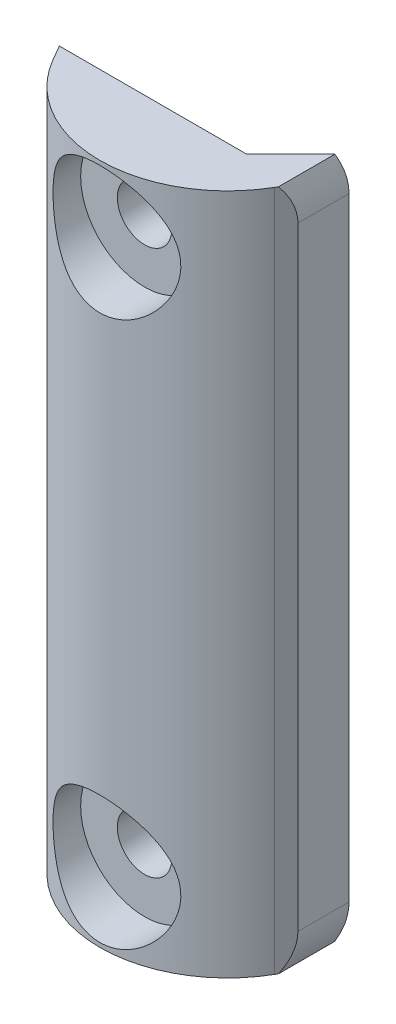
ISO-10303-21;
HEADER;
FILE_DESCRIPTION(('STEP AP214'),'2;1');
FILE_NAME('part.step','',(''),(''),'','','');
FILE_SCHEMA(('AUTOMOTIVE_DESIGN { 1 0 10303 214 1 1 1 1 }'));
ENDSEC;
DATA;
#1=APPLICATION_CONTEXT('core data for automotive mechanical design processes');
#2=APPLICATION_PROTOCOL_DEFINITION('international standard','automotive_design',2000,#1);
#3=PRODUCT_CONTEXT('',#1,'mechanical');
#4=PRODUCT('Part','Part','',(#3));
#5=PRODUCT_RELATED_PRODUCT_CATEGORY('part','',(#4));
#6=PRODUCT_DEFINITION_FORMATION('','',#4);
#7=PRODUCT_DEFINITION_CONTEXT('part definition',#1,'design');
#8=PRODUCT_DEFINITION('design','',#6,#7);
#9=PRODUCT_DEFINITION_SHAPE('','',#8);
#10=(LENGTH_UNIT() NAMED_UNIT(*) SI_UNIT(.MILLI.,.METRE.));
#11=(NAMED_UNIT(*) PLANE_ANGLE_UNIT() SI_UNIT($,.RADIAN.));
#12=(NAMED_UNIT(*) SI_UNIT($,.STERADIAN.) SOLID_ANGLE_UNIT());
#13=UNCERTAINTY_MEASURE_WITH_UNIT(LENGTH_MEASURE(1.E-05),#10,'distance_accuracy_value','');
#14=(GEOMETRIC_REPRESENTATION_CONTEXT(3) GLOBAL_UNCERTAINTY_ASSIGNED_CONTEXT((#13)) GLOBAL_UNIT_ASSIGNED_CONTEXT((#10,
#11,#12)) REPRESENTATION_CONTEXT('',''));
#15=CARTESIAN_POINT('',(0.,0.,0.));
#16=DIRECTION('',(0.,0.,1.));
#17=DIRECTION('',(1.,0.,0.));
#18=AXIS2_PLACEMENT_3D('',#15,#16,#17);
#19=CARTESIAN_POINT('',(7.00000000000001,44.2426406871193,2.87564434701783));
#20=DIRECTION('',(-1.,0.,0.));
#21=DIRECTION('',(0.,0.,1.));
#22=AXIS2_PLACEMENT_3D('',#19,#20,#21);
#23=PLANE('',#22);
#24=DIRECTION('',(0.,0.,1.));
#25=VECTOR('',#24,1.);
#26=CARTESIAN_POINT('',(7.00000000000001,38.,-0.125355652982167));
#27=LINE('',#26,#25);
#28=CARTESIAN_POINT('',(7.00000000000001,38.,-0.124355652982167));
#29=VERTEX_POINT('',#28);
#30=CARTESIAN_POINT('',(7.00000000000001,38.,2.87564434701784));
#31=VERTEX_POINT('',#30);
#32=EDGE_CURVE('E62',#29,#31,#27,.T.);
#33=ORIENTED_EDGE('',*,*,#32,.T.);
#34=DIRECTION('',(0.,-1.,0.));
#35=VECTOR('',#34,1.);
#36=CARTESIAN_POINT('',(7.,40.,2.87564434701783));
#37=LINE('',#36,#35);
#38=CARTESIAN_POINT('',(7.00000000000001,2.,2.87564434701784));
#39=VERTEX_POINT('',#38);
#40=EDGE_CURVE('E47',#31,#39,#37,.T.);
#41=ORIENTED_EDGE('',*,*,#40,.T.);
#42=DIRECTION('',(0.,0.,1.));
#43=VECTOR('',#42,1.);
#44=CARTESIAN_POINT('',(7.00000000000001,2.,-0.125355652982167));
#45=LINE('',#44,#43);
#46=CARTESIAN_POINT('',(7.00000000000001,2.,-0.124355652982164));
#47=VERTEX_POINT('',#46);
#48=EDGE_CURVE('E254',#47,#39,#45,.T.);
#49=ORIENTED_EDGE('',*,*,#48,.F.);
#50=DIRECTION('',(0.,-1.,0.));
#51=VECTOR('',#50,1.);
#52=CARTESIAN_POINT('',(7.00000000000001,44.2426406871193,-0.124355652982167));
#53=LINE('',#52,#51);
#54=EDGE_CURVE('E109',#29,#47,#53,.T.);
#55=ORIENTED_EDGE('',*,*,#54,.F.);
#56=EDGE_LOOP('',(#33,#41,#49,#55));
#57=FACE_BOUND('',#56,.T.);
#58=ADVANCED_FACE('F39',(#57),#23,.F.);
#59=CARTESIAN_POINT('',(0.,40.,0.));
#60=DIRECTION('',(0.,-1.,0.));
#61=DIRECTION('',(0.,0.,-1.));
#62=AXIS2_PLACEMENT_3D('',#59,#60,#61);
#63=CYLINDRICAL_SURFACE('',#62,7.5);
#64=CARTESIAN_POINT('',(-3.75,4.,6.49519052838329));
#65=CARTESIAN_POINT('',(-3.7499995332828,3.90225125740608,6.4951911212148));
#66=CARTESIAN_POINT('',(-3.74617277998937,3.80449381873902,6.4974047949048));
#67=CARTESIAN_POINT('',(-3.73091692606013,3.6097335863112,6.50617661684849));
#68=CARTESIAN_POINT('',(-3.7194842861398,3.5127311651566,6.51273678767321));
#69=CARTESIAN_POINT('',(-3.68914254653757,3.32011483227849,6.52997184417383));
#70=CARTESIAN_POINT('',(-3.67022172087295,3.22450334328489,6.54065318265248));
#71=CARTESIAN_POINT('',(-3.62514434035601,3.03548687342653,6.56574350107033));
#72=CARTESIAN_POINT('',(-3.59898464122629,2.94208287058496,6.58015410067491));
#73=CARTESIAN_POINT('',(-3.51040099609314,2.66716659436644,6.62809257924152));
#74=CARTESIAN_POINT('',(-3.43767108423081,2.48970075942164,6.66644910734367));
#75=CARTESIAN_POINT('',(-3.26724445668851,2.14962853393648,6.75160244955064));
#76=CARTESIAN_POINT('',(-3.16954639033667,1.98702294791917,6.79839972022374));
#77=CARTESIAN_POINT('',(-2.94250912023886,1.66636703654894,6.89988024622571));
#78=CARTESIAN_POINT('',(-2.81122482230791,1.50979856270588,6.95489557771766));
#79=CARTESIAN_POINT('',(-2.52467207702724,1.21969821189071,7.06395616655438));
#80=CARTESIAN_POINT('',(-2.36939173883305,1.08617782584436,7.11800092804766));
#81=CARTESIAN_POINT('',(-2.11524785446727,0.901579312663887,7.19613368962564));
#82=CARTESIAN_POINT('',(-2.02378397275716,0.841063504716026,7.22245236788426));
#83=CARTESIAN_POINT('',(-1.83541337870271,0.728027087266486,7.27260181684671));
#84=CARTESIAN_POINT('',(-1.73850900225946,0.675503081847481,7.29643364291624));
#85=CARTESIAN_POINT('',(-1.53985772678928,0.578956791953944,7.34092648782545));
#86=CARTESIAN_POINT('',(-1.43811090560437,0.53493437087442,7.36158755761232));
#87=CARTESIAN_POINT('',(-1.23054930522121,0.455910709459795,7.39911204265732));
#88=CARTESIAN_POINT('',(-1.12473684949786,0.420904402085983,7.41597759031591));
#89=CARTESIAN_POINT('',(-0.917458664679419,0.362482849105403,7.44435537741988));
#90=CARTESIAN_POINT('',(-0.816214704547902,0.338422981503056,7.45616184381773));
#91=CARTESIAN_POINT('',(-0.611741332907788,0.298769024285769,7.47571484869696));
#92=CARTESIAN_POINT('',(-0.508512918549626,0.283170792335508,7.48346337365117));
#93=CARTESIAN_POINT('',(-0.30091267983137,0.260635124683371,7.49468171205998));
#94=CARTESIAN_POINT('',(-0.196541191915298,0.253695206182273,7.49815275209364));
#95=CARTESIAN_POINT('',(0.0124660733361869,0.248564044049477,7.5007177504055));
#96=CARTESIAN_POINT('',(0.117101834110498,0.250372265161537,7.49981197647973));
#97=CARTESIAN_POINT('',(0.316619239654757,0.262173588951167,7.49391902644308));
#98=CARTESIAN_POINT('',(0.411555214585679,0.271438625453486,7.48929493274966));
#99=CARTESIAN_POINT('',(0.60022657560257,0.297121566597615,7.47654275259206));
#100=CARTESIAN_POINT('',(0.693961545247546,0.313541886698219,7.46841348287099));
#101=CARTESIAN_POINT('',(0.972320047683604,0.373291115191272,7.43903620774193));
#102=CARTESIAN_POINT('',(1.15428690043049,0.427119903514547,7.41279258815891));
#103=CARTESIAN_POINT('',(1.50868942056886,0.561563100440652,7.34893380486079));
#104=CARTESIAN_POINT('',(1.68095838791718,0.642537795862512,7.31116633442971));
#105=CARTESIAN_POINT('',(2.0099049530543,0.828486188707127,7.22766194749593));
#106=CARTESIAN_POINT('',(2.16657694001104,0.933468478124463,7.18192217921233));
#107=CARTESIAN_POINT('',(2.47565450443526,1.1758608619656,7.08166443610308));
#108=CARTESIAN_POINT('',(2.62625685802356,1.31539821058445,7.02672538470508));
#109=CARTESIAN_POINT('',(2.90288730883136,1.61719960504834,6.91703898816252));
#110=CARTESIAN_POINT('',(3.02889649910009,1.77948097286202,6.86229182204187));
#111=CARTESIAN_POINT('',(3.26065887757509,2.13497769992228,6.75540105485286));
#112=CARTESIAN_POINT('',(3.36461756936828,2.32950304836106,6.70364357125201));
#113=CARTESIAN_POINT('',(3.494285452366,2.63445381677261,6.63643993033366));
#114=CARTESIAN_POINT('',(3.53313496260686,2.73832038832695,6.61577433110625));
#115=CARTESIAN_POINT('',(3.60164122386986,2.94976075518148,6.57873091807787));
#116=CARTESIAN_POINT('',(3.63130364366232,3.05733221870693,6.56235046116104));
#117=CARTESIAN_POINT('',(3.67904909880129,3.26671452508286,6.53569319986531));
#118=CARTESIAN_POINT('',(3.69786013382376,3.36831178179885,6.52503727825126));
#119=CARTESIAN_POINT('',(3.72704878999596,3.57304404842724,6.5084092145175));
#120=CARTESIAN_POINT('',(3.73743079686216,3.67617823017586,6.50243463669945));
#121=CARTESIAN_POINT('',(3.74960829865518,3.88308875797436,6.49542078560213));
#122=CARTESIAN_POINT('',(3.75140699087483,3.98686485048591,6.49437967460281));
#123=CARTESIAN_POINT('',(3.74640927767189,4.19410807789939,6.49726191572437));
#124=CARTESIAN_POINT('',(3.73961345241365,4.29757523318324,6.50118493274674));
#125=CARTESIAN_POINT('',(3.70887671737916,4.58357390716258,6.51880615781322));
#126=CARTESIAN_POINT('',(3.67570217596293,4.76488844732864,6.53773948378731));
#127=CARTESIAN_POINT('',(3.58386320477273,5.11891370401775,6.58852085428305));
#128=CARTESIAN_POINT('',(3.52519052019405,5.29162161401778,6.62037308096479));
#129=CARTESIAN_POINT('',(3.38117835226484,5.63278236912677,6.69510965599548));
#130=CARTESIAN_POINT('',(3.29472964908168,5.80066766436356,6.73843663326228));
#131=CARTESIAN_POINT('',(3.09857457884213,6.12051341898648,6.83085446949345));
#132=CARTESIAN_POINT('',(2.98885626429833,6.27246563761372,6.87994828356812));
#133=CARTESIAN_POINT('',(2.73314810611396,6.57616533974955,6.9857984976656));
#134=CARTESIAN_POINT('',(2.58432946492749,6.72547252019579,7.04274071156217));
#135=CARTESIAN_POINT('',(2.26273215230043,6.99781269313374,7.15253997047034));
#136=CARTESIAN_POINT('',(2.08994541978864,7.1208368104624,7.20539563171827));
#137=CARTESIAN_POINT('',(1.81330524576242,7.28425721481626,7.27814572487862));
#138=CARTESIAN_POINT('',(1.71677761099084,7.33574690597472,7.30157207003267));
#139=CARTESIAN_POINT('',(1.51901744676028,7.43031770792977,7.3452579749171));
#140=CARTESIAN_POINT('',(1.41778705876854,7.47340260039379,7.36551895805413));
#141=CARTESIAN_POINT('',(1.21137564620036,7.55066342127815,7.40226704722017));
#142=CARTESIAN_POINT('',(1.10619651964308,7.58484356872593,7.41875593999525));
#143=CARTESIAN_POINT('',(0.89268546659841,7.64388182420224,7.44746317606939));
#144=CARTESIAN_POINT('',(0.784353915617422,7.6687410376513,7.45968202576452));
#145=CARTESIAN_POINT('',(0.575571327628318,7.70694249387556,7.4785476105054));
#146=CARTESIAN_POINT('',(0.475311860013035,7.72113369273801,7.48560346552302));
#147=CARTESIAN_POINT('',(0.273735239129529,7.74136779431982,7.49568247541691));
#148=CARTESIAN_POINT('',(0.172417744935145,7.7474079834453,7.49870428729588));
#149=CARTESIAN_POINT('',(-0.030348010644841,7.75124630934226,7.5006229044769));
#150=CARTESIAN_POINT('',(-0.131796132777061,7.74905015416865,7.49952256656362));
#151=CARTESIAN_POINT('',(-0.334067139179765,7.73646729124774,7.49324140249697));
#152=CARTESIAN_POINT('',(-0.434889780677616,7.7260775820022,7.48805908101452));
#153=CARTESIAN_POINT('',(-0.721894228310941,7.6846880621582,7.46751761798745));
#154=CARTESIAN_POINT('',(-0.90638805974079,7.6436318321176,7.44723191091293));
#155=CARTESIAN_POINT('',(-1.26545545749243,7.53502373577758,7.39470515175017));
#156=CARTESIAN_POINT('',(-1.44002759706833,7.46746806982311,7.36246238522007));
#157=CARTESIAN_POINT('',(-1.78282809808888,7.3047740547264,7.28722204565514));
#158=CARTESIAN_POINT('',(-1.95046578814058,7.20857956385876,7.2438234673891));
#159=CARTESIAN_POINT('',(-2.26790840539636,6.99265573245817,7.15080467023597));
#160=CARTESIAN_POINT('',(-2.41770509116492,6.87291558247874,7.10118159758325));
#161=CARTESIAN_POINT('',(-2.71092277296297,6.59951909418564,6.99482469589846));
#162=CARTESIAN_POINT('',(-2.852225632153,6.44367334880653,6.93787468329477));
#163=CARTESIAN_POINT('',(-3.1075030264129,6.109527090139,6.82735812939192));
#164=CARTESIAN_POINT('',(-3.22145338393805,5.93120692190352,6.77379461207439));
#165=CARTESIAN_POINT('',(-3.37081947247808,5.64683525932609,6.70005968495391));
#166=CARTESIAN_POINT('',(-3.41756760544702,5.54753025170443,6.67626523796053));
#167=CARTESIAN_POINT('',(-3.50239072437707,5.34455839339084,6.632159789709));
#168=CARTESIAN_POINT('',(-3.54047017779363,5.24089382221007,6.61184699550012));
#169=CARTESIAN_POINT('',(-3.60740781036093,5.03019409513657,6.57556519413493));
#170=CARTESIAN_POINT('',(-3.63628971173771,4.92316840541277,6.55958502841299));
#171=CARTESIAN_POINT('',(-3.68453033453638,4.70643089142036,6.53261088575373));
#172=CARTESIAN_POINT('',(-3.70389571422661,4.59672100174114,6.52161342307201));
#173=CARTESIAN_POINT('',(-3.7288673099935,4.40575158484065,6.50735655834376));
#174=CARTESIAN_POINT('',(-3.73678447367941,4.32488183783999,6.50280539589619));
#175=CARTESIAN_POINT('',(-3.74735118906735,4.16267675500333,6.49672203327325));
#176=CARTESIAN_POINT('',(-3.75000038837763,4.08134138838543,6.49519003505993));
#177=CARTESIAN_POINT('',(-3.75,4.,6.49519052838329));
#178=B_SPLINE_CURVE_WITH_KNOTS('',3,(#64,#65,#66,#67,#68,#69,#70,#71,#72,#73,#74,#75,#76,#77,
#78,#79,#80,#81,#82,#83,#84,#85,#86,#87,#88,#89,#90,#91,#92,#93,#94,#95,#96,#97,#98,#99,#100,
#101,#102,#103,#104,#105,#106,#107,#108,#109,#110,#111,#112,#113,#114,#115,#116,#117,#118,#119,
#120,#121,#122,#123,#124,#125,#126,#127,#128,#129,#130,#131,#132,#133,#134,#135,#136,#137,#138,
#139,#140,#141,#142,#143,#144,#145,#146,#147,#148,#149,#150,#151,#152,#153,#154,#155,#156,#157,
#158,#159,#160,#161,#162,#163,#164,#165,#166,#167,#168,#169,#170,#171,#172,#173,#174,#175,#176,
#177),.UNSPECIFIED.,.T.,.F.,(4,2,2,2,2,2,2,2,2,2,2,2,2,2,2,2,2,2,2,2,2,2,2,2,2,2,2,2,2,2,2,2,2,
2,2,2,2,2,2,2,2,2,2,2,2,2,2,2,2,2,2,2,2,2,2,2,4),(0.,0.293161788417365,0.586460090755329,
0.880219506909087,1.1741067212469,1.75811560789426,2.34215609364944,2.97436704509851,
3.60689228889404,3.94487698948478,4.28271766838719,4.62055291835282,4.95819788921144,
5.271965635096,5.5855796392123,5.89910369281935,6.21260856365247,6.49875386243911,
6.78499583220495,7.35691639593933,7.93674972895277,8.51679090216996,9.15166185616817,
9.78701898575671,10.4627237413891,10.8007139982955,11.1384952854625,11.4496725551619,
11.7606878119406,12.0715872061933,12.3824656146112,12.9355939984481,13.4889015863996,
14.0678357352755,14.647067853299,15.2993150043202,15.9517820567298,16.2870456992411,
16.622158143032,16.9571115221355,17.2920251647121,17.5961362460866,17.900348545663,
18.2043500551778,18.5084629796019,19.075925657509,19.6434697315285,20.2352878768082,
20.8273783536049,21.4783937942055,22.1299825815213,22.4665146367995,22.8028728636681,
23.1383563977366,23.4736048741802,23.7175424560651,23.961496355201),.UNSPECIFIED.);
#179=CARTESIAN_POINT('',(-3.75,4.,6.49519052838329));
#180=VERTEX_POINT('',#179);
#181=EDGE_CURVE('E152',#180,#180,#178,.T.);
#182=ORIENTED_EDGE('',*,*,#181,.F.);
#183=EDGE_LOOP('',(#182));
#184=FACE_BOUND('',#183,.T.);
#185=CARTESIAN_POINT('',(-3.75,36.,6.49519052838329));
#186=CARTESIAN_POINT('',(-3.74999953328279,35.9022512574061,6.49519112121481));
#187=CARTESIAN_POINT('',(-3.74617277998937,35.804493818739,6.4974047949048));
#188=CARTESIAN_POINT('',(-3.73091692606013,35.6097335863112,6.5061766168485));
#189=CARTESIAN_POINT('',(-3.7194842861398,35.5127311651566,6.51273678767321));
#190=CARTESIAN_POINT('',(-3.68914254653757,35.3201148322785,6.52997184417384));
#191=CARTESIAN_POINT('',(-3.67022172087294,35.2245033432849,6.54065318265248));
#192=CARTESIAN_POINT('',(-3.62514434035601,35.0354868734265,6.56574350107033));
#193=CARTESIAN_POINT('',(-3.59898464122629,34.942082870585,6.58015410067491));
#194=CARTESIAN_POINT('',(-3.51040099609314,34.6671665943664,6.62809257924152));
#195=CARTESIAN_POINT('',(-3.43767108423081,34.4897007594216,6.66644910734367));
#196=CARTESIAN_POINT('',(-3.26724445668851,34.1496285339365,6.75160244955064));
#197=CARTESIAN_POINT('',(-3.16954639033667,33.9870229479192,6.79839972022374));
#198=CARTESIAN_POINT('',(-2.94250912023886,33.6663670365489,6.89988024622571));
#199=CARTESIAN_POINT('',(-2.8112248223079,33.5097985627059,6.95489557771767));
#200=CARTESIAN_POINT('',(-2.52467207702724,33.2196982118907,7.06395616655438));
#201=CARTESIAN_POINT('',(-2.36939173883304,33.0861778258444,7.11800092804766));
#202=CARTESIAN_POINT('',(-2.11524785446726,32.9015793126639,7.19613368962564));
#203=CARTESIAN_POINT('',(-2.02378397275715,32.841063504716,7.22245236788426));
#204=CARTESIAN_POINT('',(-1.8354133787027,32.7280270872665,7.27260181684671));
#205=CARTESIAN_POINT('',(-1.73850900225945,32.6755030818475,7.29643364291624));
#206=CARTESIAN_POINT('',(-1.53985772678927,32.5789567919539,7.34092648782545));
#207=CARTESIAN_POINT('',(-1.43811090560436,32.5349343708744,7.36158755761232));
#208=CARTESIAN_POINT('',(-1.2305493052212,32.4559107094598,7.39911204265732));
#209=CARTESIAN_POINT('',(-1.12473684949786,32.420904402086,7.41597759031591));
#210=CARTESIAN_POINT('',(-0.917458664679413,32.3624828491054,7.44435537741988));
#211=CARTESIAN_POINT('',(-0.816214704547897,32.3384229815031,7.45616184381773));
#212=CARTESIAN_POINT('',(-0.611741332907783,32.2987690242858,7.47571484869696));
#213=CARTESIAN_POINT('',(-0.508512918549621,32.2831707923355,7.48346337365117));
#214=CARTESIAN_POINT('',(-0.300912679831365,32.2606351246834,7.49468171205998));
#215=CARTESIAN_POINT('',(-0.196541191915293,32.2536952061823,7.49815275209364));
#216=CARTESIAN_POINT('',(0.0124660733361919,32.2485640440495,7.5007177504055));
#217=CARTESIAN_POINT('',(0.117101834110504,32.2503722651615,7.49981197647973));
#218=CARTESIAN_POINT('',(0.316619239654763,32.2621735889512,7.49391902644308));
#219=CARTESIAN_POINT('',(0.411555214585684,32.2714386254535,7.48929493274966));
#220=CARTESIAN_POINT('',(0.600226575602576,32.2971215665976,7.47654275259206));
#221=CARTESIAN_POINT('',(0.693961545247551,32.3135418866982,7.46841348287099));
#222=CARTESIAN_POINT('',(0.972320047683609,32.3732911151913,7.43903620774193));
#223=CARTESIAN_POINT('',(1.15428690043049,32.4271199035145,7.41279258815891));
#224=CARTESIAN_POINT('',(1.50868942056887,32.5615631004407,7.34893380486079));
#225=CARTESIAN_POINT('',(1.68095838791719,32.6425377958625,7.31116633442971));
#226=CARTESIAN_POINT('',(2.00990495305431,32.8284861887071,7.22766194749593));
#227=CARTESIAN_POINT('',(2.16657694001105,32.9334684781245,7.18192217921233));
#228=CARTESIAN_POINT('',(2.47565450443526,33.1758608619656,7.08166443610308));
#229=CARTESIAN_POINT('',(2.62625685802357,33.3153982105844,7.02672538470508));
#230=CARTESIAN_POINT('',(2.90288730883136,33.6171996050483,6.91703898816252));
#231=CARTESIAN_POINT('',(3.02889649910009,33.779480972862,6.86229182204187));
#232=CARTESIAN_POINT('',(3.26065887757509,34.1349776999223,6.75540105485286));
#233=CARTESIAN_POINT('',(3.36461756936828,34.3295030483611,6.70364357125201));
#234=CARTESIAN_POINT('',(3.494285452366,34.6344538167726,6.63643993033366));
#235=CARTESIAN_POINT('',(3.53313496260686,34.738320388327,6.61577433110625));
#236=CARTESIAN_POINT('',(3.60164122386986,34.9497607551815,6.57873091807786));
#237=CARTESIAN_POINT('',(3.63130364366233,35.0573322187069,6.56235046116103));
#238=CARTESIAN_POINT('',(3.67904909880129,35.2667145250829,6.53569319986531));
#239=CARTESIAN_POINT('',(3.69786013382377,35.3683117817989,6.52503727825126));
#240=CARTESIAN_POINT('',(3.72704878999597,35.5730440484272,6.50840921451749));
#241=CARTESIAN_POINT('',(3.73743079686216,35.6761782301759,6.50243463669945));
#242=CARTESIAN_POINT('',(3.74960829865518,35.8830887579744,6.49542078560213));
#243=CARTESIAN_POINT('',(3.75140699087484,35.9868648504859,6.49437967460281));
#244=CARTESIAN_POINT('',(3.74640927767189,36.1941080778994,6.49726191572437));
#245=CARTESIAN_POINT('',(3.73961345241365,36.2975752331833,6.50118493274674));
#246=CARTESIAN_POINT('',(3.70887671737917,36.5835739071626,6.51880615781322));
#247=CARTESIAN_POINT('',(3.67570217596294,36.7648884473287,6.53773948378731));
#248=CARTESIAN_POINT('',(3.58386320477273,37.1189137040178,6.58852085428305));
#249=CARTESIAN_POINT('',(3.52519052019405,37.2916216140178,6.62037308096479));
#250=CARTESIAN_POINT('',(3.38117835226485,37.6327823691268,6.69510965599548));
#251=CARTESIAN_POINT('',(3.29472964908168,37.8006676643636,6.73843663326228));
#252=CARTESIAN_POINT('',(3.09857457884214,38.1205134189865,6.83085446949345));
#253=CARTESIAN_POINT('',(2.98885626429834,38.2724656376137,6.87994828356812));
#254=CARTESIAN_POINT('',(2.73314810611397,38.5761653397496,6.9857984976656));
#255=CARTESIAN_POINT('',(2.58432946492749,38.7254725201958,7.04274071156216));
#256=CARTESIAN_POINT('',(2.26273215230043,38.9978126931337,7.15253997047034));
#257=CARTESIAN_POINT('',(2.08994541978864,39.1208368104624,7.20539563171827));
#258=CARTESIAN_POINT('',(1.81330524576242,39.2842572148163,7.27814572487862));
#259=CARTESIAN_POINT('',(1.71677761099085,39.3357469059747,7.30157207003267));
#260=CARTESIAN_POINT('',(1.51901744676028,39.4303177079298,7.3452579749171));
#261=CARTESIAN_POINT('',(1.41778705876855,39.4734026003938,7.36551895805413));
#262=CARTESIAN_POINT('',(1.21137564620036,39.5506634212782,7.40226704722017));
#263=CARTESIAN_POINT('',(1.10619651964308,39.5848435687259,7.41875593999525));
#264=CARTESIAN_POINT('',(0.892685466598412,39.6438818242022,7.44746317606939));
#265=CARTESIAN_POINT('',(0.784353915617424,39.6687410376513,7.45968202576452));
#266=CARTESIAN_POINT('',(0.575571327628319,39.7069424938756,7.4785476105054));
#267=CARTESIAN_POINT('',(0.475311860013036,39.721133692738,7.48560346552302));
#268=CARTESIAN_POINT('',(0.27373523912953,39.7413677943198,7.49568247541691));
#269=CARTESIAN_POINT('',(0.172417744935148,39.7474079834453,7.49870428729588));
#270=CARTESIAN_POINT('',(-0.0303480106448369,39.7512463093423,7.5006229044769));
#271=CARTESIAN_POINT('',(-0.131796132777057,39.7490501541686,7.49952256656362));
#272=CARTESIAN_POINT('',(-0.334067139179762,39.7364672912477,7.49324140249697));
#273=CARTESIAN_POINT('',(-0.434889780677613,39.7260775820022,7.48805908101452));
#274=CARTESIAN_POINT('',(-0.721894228310938,39.6846880621582,7.46751761798745));
#275=CARTESIAN_POINT('',(-0.906388059740787,39.6436318321176,7.44723191091294));
#276=CARTESIAN_POINT('',(-1.26545545749243,39.5350237357776,7.39470515175017));
#277=CARTESIAN_POINT('',(-1.44002759706833,39.4674680698231,7.36246238522007));
#278=CARTESIAN_POINT('',(-1.78282809808887,39.3047740547264,7.28722204565514));
#279=CARTESIAN_POINT('',(-1.95046578814057,39.2085795638588,7.2438234673891));
#280=CARTESIAN_POINT('',(-2.26790840539636,38.9926557324582,7.15080467023597));
#281=CARTESIAN_POINT('',(-2.41770509116491,38.8729155824787,7.10118159758325));
#282=CARTESIAN_POINT('',(-2.71092277296296,38.5995190941856,6.99482469589846));
#283=CARTESIAN_POINT('',(-2.852225632153,38.4436733488065,6.93787468329477));
#284=CARTESIAN_POINT('',(-3.1075030264129,38.109527090139,6.82735812939192));
#285=CARTESIAN_POINT('',(-3.22145338393805,37.9312069219035,6.7737946120744));
#286=CARTESIAN_POINT('',(-3.37081947247808,37.6468352593261,6.70005968495391));
#287=CARTESIAN_POINT('',(-3.41756760544702,37.5475302517044,6.67626523796053));
#288=CARTESIAN_POINT('',(-3.50239072437707,37.3445583933908,6.632159789709));
#289=CARTESIAN_POINT('',(-3.54047017779363,37.2408938222101,6.61184699550012));
#290=CARTESIAN_POINT('',(-3.60740781036093,37.0301940951366,6.57556519413493));
#291=CARTESIAN_POINT('',(-3.6362897117377,36.9231684054128,6.55958502841299));
#292=CARTESIAN_POINT('',(-3.68453033453638,36.7064308914204,6.53261088575374));
#293=CARTESIAN_POINT('',(-3.70389571422661,36.5967210017411,6.52161342307201));
#294=CARTESIAN_POINT('',(-3.72886730999349,36.4057515848407,6.50735655834376));
#295=CARTESIAN_POINT('',(-3.73678447367941,36.32488183784,6.50280539589619));
#296=CARTESIAN_POINT('',(-3.74735118906735,36.1626767550033,6.49672203327325));
#297=CARTESIAN_POINT('',(-3.75000038837763,36.0813413883854,6.49519003505993));
#298=CARTESIAN_POINT('',(-3.75,36.,6.49519052838329));
#299=B_SPLINE_CURVE_WITH_KNOTS('',3,(#185,#186,#187,#188,#189,#190,#191,#192,#193,#194,#195,
#196,#197,#198,#199,#200,#201,#202,#203,#204,#205,#206,#207,#208,#209,#210,#211,#212,#213,#214,
#215,#216,#217,#218,#219,#220,#221,#222,#223,#224,#225,#226,#227,#228,#229,#230,#231,#232,#233,
#234,#235,#236,#237,#238,#239,#240,#241,#242,#243,#244,#245,#246,#247,#248,#249,#250,#251,#252,
#253,#254,#255,#256,#257,#258,#259,#260,#261,#262,#263,#264,#265,#266,#267,#268,#269,#270,#271,
#272,#273,#274,#275,#276,#277,#278,#279,#280,#281,#282,#283,#284,#285,#286,#287,#288,#289,#290,
#291,#292,#293,#294,#295,#296,#297,#298),.UNSPECIFIED.,.T.,.F.,(4,2,2,2,2,2,2,2,2,2,2,2,2,2,2,2,
2,2,2,2,2,2,2,2,2,2,2,2,2,2,2,2,2,2,2,2,2,2,2,2,2,2,2,2,2,2,2,2,2,2,2,2,2,2,2,2,4),(0.,
0.293161788417369,0.586460090755328,0.880219506909085,1.1741067212469,1.75811560789426,
2.34215609364944,2.97436704509851,3.60689228889405,3.94487698948478,4.28271766838719,
4.62055291835282,4.95819788921144,5.27196563509601,5.5855796392123,5.89910369281935,
6.21260856365247,6.49875386243911,6.78499583220495,7.35691639593933,7.93674972895277,
8.51679090216996,9.15166185616816,9.78701898575671,10.4627237413891,10.8007139982955,
11.1384952854626,11.4496725551619,11.7606878119406,12.0715872061933,12.3824656146112,
12.9355939984482,13.4889015863996,14.0678357352755,14.647067853299,15.2993150043202,
15.9517820567298,16.2870456992411,16.622158143032,16.9571115221355,17.2920251647121,
17.5961362460866,17.900348545663,18.2043500551778,18.5084629796019,19.075925657509,
19.6434697315285,20.2352878768082,20.827378353605,21.4783937942055,22.1299825815213,
22.4665146367995,22.8028728636681,23.1383563977366,23.4736048741802,23.7175424560651,
23.961496355201),.UNSPECIFIED.);
#300=CARTESIAN_POINT('',(-3.75,36.,6.49519052838329));
#301=VERTEX_POINT('',#300);
#302=EDGE_CURVE('E162',#301,#301,#299,.T.);
#303=ORIENTED_EDGE('',*,*,#302,.F.);
#304=EDGE_LOOP('',(#303));
#305=FACE_BOUND('',#304,.T.);
#306=CARTESIAN_POINT('',(0.,0.,0.));
#307=DIRECTION('',(0.,1.,0.));
#308=DIRECTION('',(0.,0.,1.));
#309=AXIS2_PLACEMENT_3D('',#306,#307,#308);
#310=CIRCLE('',#309,7.5);
#311=CARTESIAN_POINT('',(-6.49519052838334,0.,3.74999999999992));
#312=VERTEX_POINT('',#311);
#313=CARTESIAN_POINT('',(6.49519052838334,0.,3.74999999999992));
#314=VERTEX_POINT('',#313);
#315=EDGE_CURVE('E138',#312,#314,#310,.T.);
#316=ORIENTED_EDGE('',*,*,#315,.T.);
#317=DIRECTION('',(0.,-1.,0.));
#318=VECTOR('',#317,1.);
#319=CARTESIAN_POINT('',(6.49519052838334,40.,3.74999999999992));
#320=LINE('',#319,#318);
#321=CARTESIAN_POINT('',(6.49519052838334,40.,3.74999999999992));
#322=VERTEX_POINT('',#321);
#323=EDGE_CURVE('E11',#322,#314,#320,.T.);
#324=ORIENTED_EDGE('',*,*,#323,.F.);
#325=CARTESIAN_POINT('',(0.,40.,0.));
#326=DIRECTION('',(0.,1.,0.));
#327=DIRECTION('',(0.,0.,1.));
#328=AXIS2_PLACEMENT_3D('',#325,#326,#327);
#329=CIRCLE('',#328,7.5);
#330=CARTESIAN_POINT('',(-6.49519052838334,40.,3.74999999999992));
#331=VERTEX_POINT('',#330);
#332=EDGE_CURVE('E133',#331,#322,#329,.T.);
#333=ORIENTED_EDGE('',*,*,#332,.F.);
#334=DIRECTION('',(0.,-1.,0.));
#335=VECTOR('',#334,1.);
#336=CARTESIAN_POINT('',(-6.49519052838334,40.,3.74999999999992));
#337=LINE('',#336,#335);
#338=EDGE_CURVE('E125',#331,#312,#337,.T.);
#339=ORIENTED_EDGE('',*,*,#338,.T.);
#340=EDGE_LOOP('',(#316,#324,#333,#339));
#341=FACE_BOUND('',#340,.T.);
#342=ADVANCED_FACE('F41',(#184,#305,#341),#63,.T.);
#343=CARTESIAN_POINT('',(7.,40.,2.87564434701783));
#344=DIRECTION('',(-0.866025403784445,0.,-0.499999999999989));
#345=DIRECTION('',(-0.499999999999989,0.,0.866025403784445));
#346=AXIS2_PLACEMENT_3D('',#343,#344,#345);
#347=PLANE('',#346);
#348=DIRECTION('',(0.499999999999989,0.,-0.866025403784445));
#349=VECTOR('',#348,1.);
#350=CARTESIAN_POINT('',(7.,0.,2.87564434701783));
#351=LINE('',#350,#349);
#352=CARTESIAN_POINT('',(6.58257569495584,0.,3.59864445166847));
#353=VERTEX_POINT('',#352);
#354=EDGE_CURVE('E136',#314,#353,#351,.T.);
#355=ORIENTED_EDGE('',*,*,#354,.T.);
#356=CARTESIAN_POINT('',(2.,2.,11.5358983848625));
#357=DIRECTION('',(-0.866025403784445,0.,-0.499999999999989));
#358=DIRECTION('',(0.499999999999989,0.,-0.866025403784445));
#359=AXIS2_PLACEMENT_3D('',#356,#357,#358);
#360=ELLIPSE('',#359,10.0000000000002,5.);
#361=EDGE_CURVE('E119',#39,#353,#360,.T.);
#362=ORIENTED_EDGE('',*,*,#361,.F.);
#363=ORIENTED_EDGE('',*,*,#40,.F.);
#364=CARTESIAN_POINT('',(2.,38.,11.5358983848625));
#365=DIRECTION('',(-0.866025403784445,0.,-0.499999999999989));
#366=DIRECTION('',(0.499999999999989,0.,-0.866025403784445));
#367=AXIS2_PLACEMENT_3D('',#364,#365,#366);
#368=ELLIPSE('',#367,10.0000000000002,5.);
#369=CARTESIAN_POINT('',(6.58257569495584,40.,3.59864445166847));
#370=VERTEX_POINT('',#369);
#371=EDGE_CURVE('E114',#370,#31,#368,.T.);
#372=ORIENTED_EDGE('',*,*,#371,.F.);
#373=DIRECTION('',(0.499999999999989,0.,-0.866025403784445));
#374=VECTOR('',#373,1.);
#375=CARTESIAN_POINT('',(7.,40.,2.87564434701783));
#376=LINE('',#375,#374);
#377=EDGE_CURVE('E145',#322,#370,#376,.T.);
#378=ORIENTED_EDGE('',*,*,#377,.F.);
#379=ORIENTED_EDGE('',*,*,#323,.T.);
#380=EDGE_LOOP('',(#355,#362,#363,#372,#378,#379));
#381=FACE_BOUND('',#380,.T.);
#382=ADVANCED_FACE('F122',(#381),#347,.F.);
#383=CARTESIAN_POINT('',(-7.,40.,2.87564434701783));
#384=DIRECTION('',(0.,0.,1.));
#385=DIRECTION('',(1.,0.,0.));
#386=AXIS2_PLACEMENT_3D('',#383,#384,#385);
#387=PLANE('',#386);
#388=CARTESIAN_POINT('',(0.,4.,2.87564434701783));
#389=DIRECTION('',(0.,0.,-1.));
#390=DIRECTION('',(-1.,0.,0.));
#391=AXIS2_PLACEMENT_3D('',#388,#389,#390);
#392=CIRCLE('',#391,1.6);
#393=CARTESIAN_POINT('',(-1.6,4.,2.87564434701783));
#394=VERTEX_POINT('',#393);
#395=EDGE_CURVE('E141',#394,#394,#392,.T.);
#396=ORIENTED_EDGE('',*,*,#395,.F.);
#397=EDGE_LOOP('',(#396));
#398=FACE_BOUND('',#397,.T.);
#399=CARTESIAN_POINT('',(0.,36.,2.87564434701783));
#400=DIRECTION('',(0.,0.,-1.));
#401=DIRECTION('',(-1.,0.,0.));
#402=AXIS2_PLACEMENT_3D('',#399,#400,#401);
#403=CIRCLE('',#402,1.6);
#404=CARTESIAN_POINT('',(-1.59999999999999,36.,2.87564434701783));
#405=VERTEX_POINT('',#404);
#406=EDGE_CURVE('E149',#405,#405,#403,.T.);
#407=ORIENTED_EDGE('',*,*,#406,.F.);
#408=EDGE_LOOP('',(#407));
#409=FACE_BOUND('',#408,.T.);
#410=DIRECTION('',(-1.,0.,0.));
#411=VECTOR('',#410,1.);
#412=CARTESIAN_POINT('',(-7.,40.,2.87564434701783));
#413=LINE('',#412,#411);
#414=CARTESIAN_POINT('',(4.00000000000001,40.,2.87564434701783));
#415=VERTEX_POINT('',#414);
#416=CARTESIAN_POINT('',(-7.,40.,2.87564434701783));
#417=VERTEX_POINT('',#416);
#418=EDGE_CURVE('E143',#415,#417,#413,.T.);
#419=ORIENTED_EDGE('',*,*,#418,.F.);
#420=DIRECTION('',(0.,-1.,0.));
#421=VECTOR('',#420,1.);
#422=CARTESIAN_POINT('',(4.00000000000001,44.2426406871193,2.87564434701783));
#423=LINE('',#422,#421);
#424=CARTESIAN_POINT('',(4.00000000000001,0.,2.87564434701783));
#425=VERTEX_POINT('',#424);
#426=EDGE_CURVE('E110',#415,#425,#423,.T.);
#427=ORIENTED_EDGE('',*,*,#426,.T.);
#428=DIRECTION('',(-1.,0.,0.));
#429=VECTOR('',#428,1.);
#430=CARTESIAN_POINT('',(-7.,0.,2.87564434701783));
#431=LINE('',#430,#429);
#432=CARTESIAN_POINT('',(-7.,0.,2.87564434701783));
#433=VERTEX_POINT('',#432);
#434=EDGE_CURVE('E134',#425,#433,#431,.T.);
#435=ORIENTED_EDGE('',*,*,#434,.T.);
#436=DIRECTION('',(0.,-1.,0.));
#437=VECTOR('',#436,1.);
#438=CARTESIAN_POINT('',(-7.,40.,2.87564434701783));
#439=LINE('',#438,#437);
#440=EDGE_CURVE('E123',#417,#433,#439,.T.);
#441=ORIENTED_EDGE('',*,*,#440,.F.);
#442=EDGE_LOOP('',(#419,#427,#435,#441));
#443=FACE_BOUND('',#442,.T.);
#444=ADVANCED_FACE('F202',(#398,#409,#443),#387,.F.);
#445=CARTESIAN_POINT('',(-6.49519052838334,40.,3.74999999999992));
#446=DIRECTION('',(0.866025403784445,0.,-0.49999999999999));
#447=DIRECTION('',(-0.49999999999999,0.,-0.866025403784445));
#448=AXIS2_PLACEMENT_3D('',#445,#446,#447);
#449=PLANE('',#448);
#450=DIRECTION('',(0.49999999999999,0.,0.866025403784444));
#451=VECTOR('',#450,1.);
#452=CARTESIAN_POINT('',(-6.49519052838334,0.,3.74999999999992));
#453=LINE('',#452,#451);
#454=EDGE_CURVE('E131',#433,#312,#453,.T.);
#455=ORIENTED_EDGE('',*,*,#454,.T.);
#456=ORIENTED_EDGE('',*,*,#338,.F.);
#457=DIRECTION('',(0.49999999999999,0.,0.866025403784444));
#458=VECTOR('',#457,1.);
#459=CARTESIAN_POINT('',(-6.49519052838334,40.,3.74999999999992));
#460=LINE('',#459,#458);
#461=EDGE_CURVE('E130',#417,#331,#460,.T.);
#462=ORIENTED_EDGE('',*,*,#461,.F.);
#463=ORIENTED_EDGE('',*,*,#440,.T.);
#464=EDGE_LOOP('',(#455,#456,#462,#463));
#465=FACE_BOUND('',#464,.T.);
#466=ADVANCED_FACE('F195',(#465),#449,.F.);
#467=CARTESIAN_POINT('',(0.,40.,0.));
#468=DIRECTION('',(0.,1.,0.));
#469=DIRECTION('',(0.,0.,1.));
#470=AXIS2_PLACEMENT_3D('',#467,#468,#469);
#471=PLANE('',#470);
#472=DIRECTION('',(0.,0.,-1.));
#473=VECTOR('',#472,1.);
#474=CARTESIAN_POINT('',(6.58257569495584,40.,7.501));
#475=LINE('',#474,#473);
#476=CARTESIAN_POINT('',(6.58257569495585,40.,0.293068652062));
#477=VERTEX_POINT('',#476);
#478=EDGE_CURVE('E116',#370,#477,#475,.T.);
#479=ORIENTED_EDGE('',*,*,#478,.T.);
#480=DIRECTION('',(-0.707106781186547,0.,0.707106781186548));
#481=VECTOR('',#480,1.);
#482=CARTESIAN_POINT('',(7.00000000000001,40.,-0.124355652982167));
#483=LINE('',#482,#481);
#484=EDGE_CURVE('E243',#477,#415,#483,.T.);
#485=ORIENTED_EDGE('',*,*,#484,.T.);
#486=ORIENTED_EDGE('',*,*,#418,.T.);
#487=ORIENTED_EDGE('',*,*,#461,.T.);
#488=ORIENTED_EDGE('',*,*,#332,.T.);
#489=ORIENTED_EDGE('',*,*,#377,.T.);
#490=EDGE_LOOP('',(#479,#485,#486,#487,#488,#489));
#491=FACE_BOUND('',#490,.T.);
#492=ADVANCED_FACE('F192',(#491),#471,.T.);
#493=CARTESIAN_POINT('',(0.,0.,0.));
#494=DIRECTION('',(0.,1.,0.));
#495=DIRECTION('',(0.,0.,1.));
#496=AXIS2_PLACEMENT_3D('',#493,#494,#495);
#497=PLANE('',#496);
#498=DIRECTION('',(-0.707106781186547,0.,0.707106781186548));
#499=VECTOR('',#498,1.);
#500=CARTESIAN_POINT('',(7.00000000000001,0.,-0.124355652982167));
#501=LINE('',#500,#499);
#502=CARTESIAN_POINT('',(6.58257569495585,0.,0.293068652062001));
#503=VERTEX_POINT('',#502);
#504=EDGE_CURVE('E249',#503,#425,#501,.T.);
#505=ORIENTED_EDGE('',*,*,#504,.F.);
#506=DIRECTION('',(0.,0.,-1.));
#507=VECTOR('',#506,1.);
#508=CARTESIAN_POINT('',(6.58257569495584,0.,7.501));
#509=LINE('',#508,#507);
#510=EDGE_CURVE('E54',#353,#503,#509,.T.);
#511=ORIENTED_EDGE('',*,*,#510,.F.);
#512=ORIENTED_EDGE('',*,*,#354,.F.);
#513=ORIENTED_EDGE('',*,*,#315,.F.);
#514=ORIENTED_EDGE('',*,*,#454,.F.);
#515=ORIENTED_EDGE('',*,*,#434,.F.);
#516=EDGE_LOOP('',(#505,#511,#512,#513,#514,#515));
#517=FACE_BOUND('',#516,.T.);
#518=ADVANCED_FACE('F190',(#517),#497,.F.);
#519=CARTESIAN_POINT('',(0.,36.,7.501));
#520=DIRECTION('',(0.,0.,-1.));
#521=DIRECTION('',(-1.,0.,0.));
#522=AXIS2_PLACEMENT_3D('',#519,#520,#521);
#523=CYLINDRICAL_SURFACE('',#522,1.6);
#524=CARTESIAN_POINT('',(0.,36.,4.87564434701783));
#525=DIRECTION('',(0.,0.,-1.));
#526=DIRECTION('',(-1.,0.,0.));
#527=AXIS2_PLACEMENT_3D('',#524,#525,#526);
#528=CIRCLE('',#527,1.6);
#529=CARTESIAN_POINT('',(-1.59999999999999,36.,4.87564434701783));
#530=VERTEX_POINT('',#529);
#531=EDGE_CURVE('E159',#530,#530,#528,.T.);
#532=ORIENTED_EDGE('',*,*,#531,.F.);
#533=EDGE_LOOP('',(#532));
#534=FACE_BOUND('',#533,.T.);
#535=ORIENTED_EDGE('',*,*,#406,.T.);
#536=EDGE_LOOP('',(#535));
#537=FACE_BOUND('',#536,.T.);
#538=ADVANCED_FACE('F186',(#534,#537),#523,.F.);
#539=CARTESIAN_POINT('',(0.,4.,7.501));
#540=DIRECTION('',(0.,0.,-1.));
#541=DIRECTION('',(-1.,0.,0.));
#542=AXIS2_PLACEMENT_3D('',#539,#540,#541);
#543=CYLINDRICAL_SURFACE('',#542,1.6);
#544=CARTESIAN_POINT('',(0.,4.,4.87564434701783));
#545=DIRECTION('',(0.,0.,-1.));
#546=DIRECTION('',(-1.,0.,0.));
#547=AXIS2_PLACEMENT_3D('',#544,#545,#546);
#548=CIRCLE('',#547,1.6);
#549=CARTESIAN_POINT('',(-1.6,4.,4.87564434701783));
#550=VERTEX_POINT('',#549);
#551=EDGE_CURVE('E237',#550,#550,#548,.T.);
#552=ORIENTED_EDGE('',*,*,#551,.F.);
#553=EDGE_LOOP('',(#552));
#554=FACE_BOUND('',#553,.T.);
#555=ORIENTED_EDGE('',*,*,#395,.T.);
#556=EDGE_LOOP('',(#555));
#557=FACE_BOUND('',#556,.T.);
#558=ADVANCED_FACE('F182',(#554,#557),#543,.F.);
#559=CARTESIAN_POINT('',(0.,4.,7.501));
#560=DIRECTION('',(0.,0.,-1.));
#561=DIRECTION('',(-1.,0.,0.));
#562=AXIS2_PLACEMENT_3D('',#559,#560,#561);
#563=CYLINDRICAL_SURFACE('',#562,3.75);
#564=CARTESIAN_POINT('',(0.,4.,4.87564434701783));
#565=DIRECTION('',(0.,0.,-1.));
#566=DIRECTION('',(-1.,0.,0.));
#567=AXIS2_PLACEMENT_3D('',#564,#565,#566);
#568=CIRCLE('',#567,3.75);
#569=CARTESIAN_POINT('',(-3.75,4.,4.87564434701784));
#570=VERTEX_POINT('',#569);
#571=EDGE_CURVE('E158',#570,#570,#568,.T.);
#572=ORIENTED_EDGE('',*,*,#571,.T.);
#573=EDGE_LOOP('',(#572));
#574=FACE_BOUND('',#573,.T.);
#575=ORIENTED_EDGE('',*,*,#181,.T.);
#576=EDGE_LOOP('',(#575));
#577=FACE_BOUND('',#576,.T.);
#578=ADVANCED_FACE('F185',(#574,#577),#563,.F.);
#579=CARTESIAN_POINT('',(0.,4.,4.87564434701783));
#580=DIRECTION('',(0.,0.,-1.));
#581=DIRECTION('',(-1.,0.,0.));
#582=AXIS2_PLACEMENT_3D('',#579,#580,#581);
#583=PLANE('',#582);
#584=ORIENTED_EDGE('',*,*,#551,.T.);
#585=EDGE_LOOP('',(#584));
#586=FACE_BOUND('',#585,.T.);
#587=ORIENTED_EDGE('',*,*,#571,.F.);
#588=EDGE_LOOP('',(#587));
#589=FACE_BOUND('',#588,.T.);
#590=ADVANCED_FACE('F224',(#586,#589),#583,.F.);
#591=CARTESIAN_POINT('',(0.,36.,7.501));
#592=DIRECTION('',(0.,0.,-1.));
#593=DIRECTION('',(-1.,0.,0.));
#594=AXIS2_PLACEMENT_3D('',#591,#592,#593);
#595=CYLINDRICAL_SURFACE('',#594,3.75);
#596=CARTESIAN_POINT('',(0.,36.,4.87564434701783));
#597=DIRECTION('',(0.,0.,-1.));
#598=DIRECTION('',(-1.,0.,0.));
#599=AXIS2_PLACEMENT_3D('',#596,#597,#598);
#600=CIRCLE('',#599,3.75);
#601=CARTESIAN_POINT('',(-3.75,36.,4.87564434701784));
#602=VERTEX_POINT('',#601);
#603=EDGE_CURVE('E155',#602,#602,#600,.T.);
#604=ORIENTED_EDGE('',*,*,#603,.T.);
#605=EDGE_LOOP('',(#604));
#606=FACE_BOUND('',#605,.T.);
#607=ORIENTED_EDGE('',*,*,#302,.T.);
#608=EDGE_LOOP('',(#607));
#609=FACE_BOUND('',#608,.T.);
#610=ADVANCED_FACE('F176',(#606,#609),#595,.F.);
#611=CARTESIAN_POINT('',(0.,36.,4.87564434701783));
#612=DIRECTION('',(0.,0.,-1.));
#613=DIRECTION('',(-1.,0.,0.));
#614=AXIS2_PLACEMENT_3D('',#611,#612,#613);
#615=PLANE('',#614);
#616=ORIENTED_EDGE('',*,*,#531,.T.);
#617=EDGE_LOOP('',(#616));
#618=FACE_BOUND('',#617,.T.);
#619=ORIENTED_EDGE('',*,*,#603,.F.);
#620=EDGE_LOOP('',(#619));
#621=FACE_BOUND('',#620,.T.);
#622=ADVANCED_FACE('F181',(#618,#621),#615,.F.);
#623=CARTESIAN_POINT('',(2.,2.,7.501));
#624=DIRECTION('',(0.,0.,-1.));
#625=DIRECTION('',(-1.,0.,0.));
#626=AXIS2_PLACEMENT_3D('',#623,#624,#625);
#627=CYLINDRICAL_SURFACE('',#626,5.);
#628=ORIENTED_EDGE('',*,*,#361,.T.);
#629=ORIENTED_EDGE('',*,*,#510,.T.);
#630=CARTESIAN_POINT('',(2.,2.,4.87564434701785));
#631=DIRECTION('',(0.707106781186548,0.,0.707106781186547));
#632=DIRECTION('',(-0.707106781186547,0.,0.707106781186548));
#633=AXIS2_PLACEMENT_3D('',#630,#631,#632);
#634=ELLIPSE('',#633,7.07106781186549,5.00000000000001);
#635=EDGE_CURVE('E252',#503,#47,#634,.T.);
#636=ORIENTED_EDGE('',*,*,#635,.T.);
#637=ORIENTED_EDGE('',*,*,#48,.T.);
#638=EDGE_LOOP('',(#628,#629,#636,#637));
#639=FACE_BOUND('',#638,.T.);
#640=ADVANCED_FACE('F218',(#639),#627,.T.);
#641=CARTESIAN_POINT('',(2.,38.,7.501));
#642=DIRECTION('',(0.,0.,-1.));
#643=DIRECTION('',(-1.,0.,0.));
#644=AXIS2_PLACEMENT_3D('',#641,#642,#643);
#645=CYLINDRICAL_SURFACE('',#644,5.);
#646=ORIENTED_EDGE('',*,*,#371,.T.);
#647=ORIENTED_EDGE('',*,*,#32,.F.);
#648=CARTESIAN_POINT('',(2.,38.,4.87564434701785));
#649=DIRECTION('',(0.707106781186548,0.,0.707106781186547));
#650=DIRECTION('',(-0.707106781186547,0.,0.707106781186548));
#651=AXIS2_PLACEMENT_3D('',#648,#649,#650);
#652=ELLIPSE('',#651,7.07106781186549,5.00000000000001);
#653=EDGE_CURVE('E111',#29,#477,#652,.T.);
#654=ORIENTED_EDGE('',*,*,#653,.T.);
#655=ORIENTED_EDGE('',*,*,#478,.F.);
#656=EDGE_LOOP('',(#646,#647,#654,#655));
#657=FACE_BOUND('',#656,.T.);
#658=ADVANCED_FACE('F115',(#657),#645,.T.);
#659=CARTESIAN_POINT('',(7.00000000000001,44.2426406871193,-0.124355652982167));
#660=DIRECTION('',(0.707106781186548,0.,0.707106781186547));
#661=DIRECTION('',(0.707106781186547,0.,-0.707106781186548));
#662=AXIS2_PLACEMENT_3D('',#659,#660,#661);
#663=PLANE('',#662);
#664=ORIENTED_EDGE('',*,*,#484,.F.);
#665=ORIENTED_EDGE('',*,*,#653,.F.);
#666=ORIENTED_EDGE('',*,*,#54,.T.);
#667=ORIENTED_EDGE('',*,*,#635,.F.);
#668=ORIENTED_EDGE('',*,*,#504,.T.);
#669=ORIENTED_EDGE('',*,*,#426,.F.);
#670=EDGE_LOOP('',(#664,#665,#666,#667,#668,#669));
#671=FACE_BOUND('',#670,.T.);
#672=ADVANCED_FACE('F217',(#671),#663,.F.);
#673=CLOSED_SHELL('',(#58,#342,#382,#444,#466,#492,#518,#538,#558,#578,#590,#610,#622,#640,#658,#672));
#674=MANIFOLD_SOLID_BREP('B2',#673);
#675=ADVANCED_BREP_SHAPE_REPRESENTATION('',(#18,#674),#14);
#676=SHAPE_DEFINITION_REPRESENTATION(#9,#675);
ENDSEC;
END-ISO-10303-21;
